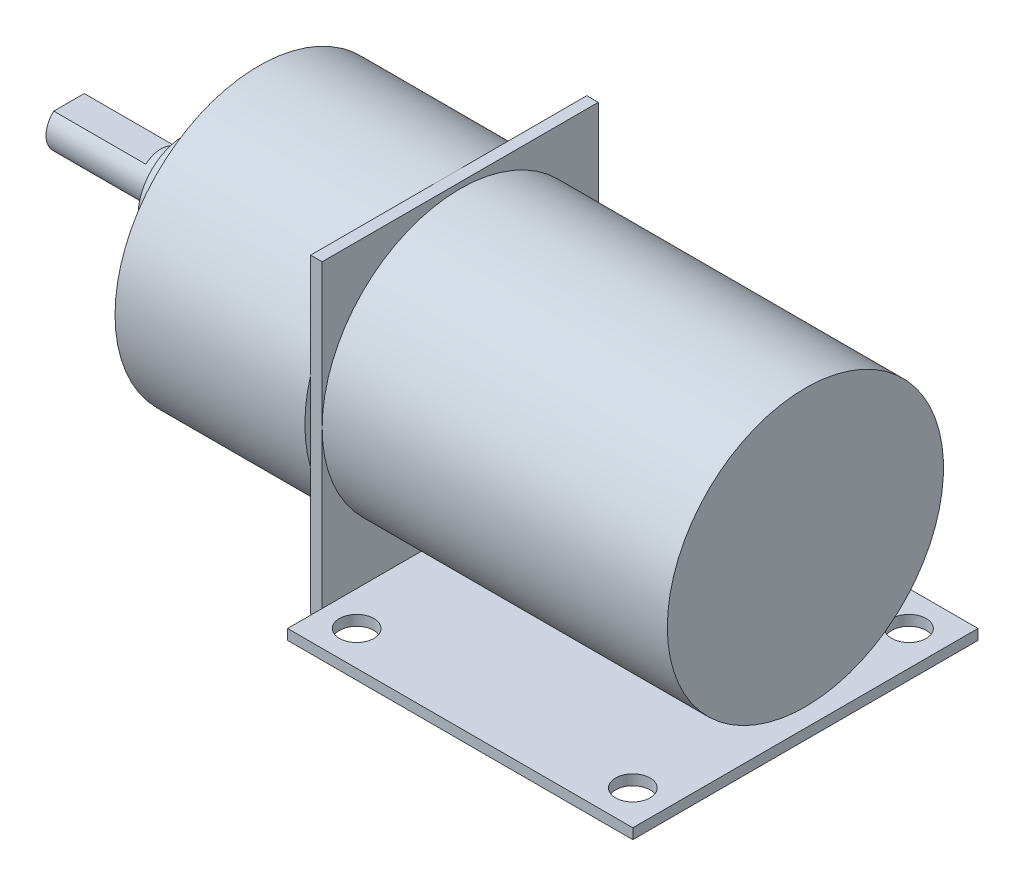
ISO-10303-21;
HEADER;
FILE_DESCRIPTION(('STEP AP214'),'2;1');
FILE_NAME('part.step','',(''),(''),'','','');
FILE_SCHEMA(('AUTOMOTIVE_DESIGN { 1 0 10303 214 1 1 1 1 }'));
ENDSEC;
DATA;
#1=APPLICATION_CONTEXT('core data for automotive mechanical design processes');
#2=APPLICATION_PROTOCOL_DEFINITION('international standard','automotive_design',2000,#1);
#3=PRODUCT_CONTEXT('',#1,'mechanical');
#4=PRODUCT('Part','Part','',(#3));
#5=PRODUCT_RELATED_PRODUCT_CATEGORY('part','',(#4));
#6=PRODUCT_DEFINITION_FORMATION('','',#4);
#7=PRODUCT_DEFINITION_CONTEXT('part definition',#1,'design');
#8=PRODUCT_DEFINITION('design','',#6,#7);
#9=PRODUCT_DEFINITION_SHAPE('','',#8);
#10=(LENGTH_UNIT() NAMED_UNIT(*) SI_UNIT(.MILLI.,.METRE.));
#11=(NAMED_UNIT(*) PLANE_ANGLE_UNIT() SI_UNIT($,.RADIAN.));
#12=(NAMED_UNIT(*) SI_UNIT($,.STERADIAN.) SOLID_ANGLE_UNIT());
#13=UNCERTAINTY_MEASURE_WITH_UNIT(LENGTH_MEASURE(1.E-05),#10,'distance_accuracy_value','');
#14=(GEOMETRIC_REPRESENTATION_CONTEXT(3) GLOBAL_UNCERTAINTY_ASSIGNED_CONTEXT((#13)) GLOBAL_UNIT_ASSIGNED_CONTEXT((#10,
#11,#12)) REPRESENTATION_CONTEXT('',''));
#15=CARTESIAN_POINT('',(0.,0.,0.));
#16=DIRECTION('',(0.,0.,1.));
#17=DIRECTION('',(1.,0.,0.));
#18=AXIS2_PLACEMENT_3D('',#15,#16,#17);
#19=CARTESIAN_POINT('',(-16.,27.,12.));
#20=DIRECTION('',(1.,0.,0.));
#21=DIRECTION('',(0.,0.,-1.));
#22=AXIS2_PLACEMENT_3D('',#19,#20,#21);
#23=PLANE('',#22);
#24=CARTESIAN_POINT('',(-16.,14.5,0.));
#25=DIRECTION('',(-1.,0.,0.));
#26=DIRECTION('',(0.,0.,1.));
#27=AXIS2_PLACEMENT_3D('',#24,#25,#26);
#28=CIRCLE('',#27,12.5);
#29=CARTESIAN_POINT('',(-16.,18.,12.));
#30=VERTEX_POINT('',#29);
#31=CARTESIAN_POINT('',(-16.,27.,0.));
#32=VERTEX_POINT('',#31);
#33=EDGE_CURVE('E172',#30,#32,#28,.T.);
#34=ORIENTED_EDGE('',*,*,#33,.F.);
#35=DIRECTION('',(0.,-1.,0.));
#36=VECTOR('',#35,1.);
#37=CARTESIAN_POINT('',(-16.,27.,12.));
#38=LINE('',#37,#36);
#39=CARTESIAN_POINT('',(-16.,27.,12.));
#40=VERTEX_POINT('',#39);
#41=EDGE_CURVE('E206',#40,#30,#38,.T.);
#42=ORIENTED_EDGE('',*,*,#41,.F.);
#43=DIRECTION('',(0.,0.,1.));
#44=VECTOR('',#43,1.);
#45=CARTESIAN_POINT('',(-16.,27.,12.));
#46=LINE('',#45,#44);
#47=EDGE_CURVE('E189',#32,#40,#46,.T.);
#48=ORIENTED_EDGE('',*,*,#47,.F.);
#49=EDGE_LOOP('',(#34,#42,#48));
#50=FACE_BOUND('',#49,.T.);
#51=ADVANCED_FACE('F33',(#50),#23,.F.);
#52=CARTESIAN_POINT('',(-16.,18.,-12.));
#53=VERTEX_POINT('',#52);
#54=EDGE_CURVE('E167',#32,#53,#28,.T.);
#55=ORIENTED_EDGE('',*,*,#54,.F.);
#56=CARTESIAN_POINT('',(-16.,27.,-12.));
#57=VERTEX_POINT('',#56);
#58=EDGE_CURVE('E190',#57,#32,#46,.T.);
#59=ORIENTED_EDGE('',*,*,#58,.F.);
#60=DIRECTION('',(0.,-1.,0.));
#61=VECTOR('',#60,1.);
#62=CARTESIAN_POINT('',(-16.,27.,-12.));
#63=LINE('',#62,#61);
#64=EDGE_CURVE('E211',#57,#53,#63,.T.);
#65=ORIENTED_EDGE('',*,*,#64,.T.);
#66=EDGE_LOOP('',(#55,#59,#65));
#67=FACE_BOUND('',#66,.T.);
#68=ADVANCED_FACE('F338',(#67),#23,.F.);
#69=CARTESIAN_POINT('',(-15.,27.,12.));
#70=DIRECTION('',(-1.,0.,0.));
#71=DIRECTION('',(0.,0.,1.));
#72=AXIS2_PLACEMENT_3D('',#69,#70,#71);
#73=PLANE('',#72);
#74=CARTESIAN_POINT('',(-15.,14.5,0.));
#75=DIRECTION('',(1.,0.,0.));
#76=DIRECTION('',(0.,0.,-1.));
#77=AXIS2_PLACEMENT_3D('',#74,#75,#76);
#78=CIRCLE('',#77,12.);
#79=CARTESIAN_POINT('',(-15.,14.5,12.));
#80=VERTEX_POINT('',#79);
#81=CARTESIAN_POINT('',(-15.,14.5,-12.));
#82=VERTEX_POINT('',#81);
#83=EDGE_CURVE('E171',#80,#82,#78,.T.);
#84=ORIENTED_EDGE('',*,*,#83,.F.);
#85=DIRECTION('',(0.,-1.,0.));
#86=VECTOR('',#85,1.);
#87=CARTESIAN_POINT('',(-15.,27.,12.));
#88=LINE('',#87,#86);
#89=CARTESIAN_POINT('',(-15.,0.900000000000001,12.));
#90=VERTEX_POINT('',#89);
#91=EDGE_CURVE('E195',#80,#90,#88,.T.);
#92=ORIENTED_EDGE('',*,*,#91,.T.);
#93=DIRECTION('',(0.,0.,1.));
#94=VECTOR('',#93,1.);
#95=CARTESIAN_POINT('',(-15.,0.9,15.));
#96=LINE('',#95,#94);
#97=CARTESIAN_POINT('',(-15.,0.900000000000001,-12.));
#98=VERTEX_POINT('',#97);
#99=EDGE_CURVE('E249',#98,#90,#96,.T.);
#100=ORIENTED_EDGE('',*,*,#99,.F.);
#101=DIRECTION('',(0.,-1.,0.));
#102=VECTOR('',#101,1.);
#103=CARTESIAN_POINT('',(-15.,27.,-12.));
#104=LINE('',#103,#102);
#105=EDGE_CURVE('E214',#82,#98,#104,.T.);
#106=ORIENTED_EDGE('',*,*,#105,.F.);
#107=EDGE_LOOP('',(#84,#92,#100,#106));
#108=FACE_BOUND('',#107,.T.);
#109=ADVANCED_FACE('F289',(#108),#73,.F.);
#110=CARTESIAN_POINT('',(-15.,0.9,15.));
#111=DIRECTION('',(1.,0.,0.));
#112=DIRECTION('',(0.,0.,-1.));
#113=AXIS2_PLACEMENT_3D('',#110,#111,#112);
#114=PLANE('',#113);
#115=CARTESIAN_POINT('',(-15.,0.,-12.));
#116=VERTEX_POINT('',#115);
#117=EDGE_CURVE('E220',#98,#116,#104,.T.);
#118=ORIENTED_EDGE('',*,*,#117,.F.);
#119=CARTESIAN_POINT('',(-15.,0.9,-15.));
#120=VERTEX_POINT('',#119);
#121=EDGE_CURVE('E245',#120,#98,#96,.T.);
#122=ORIENTED_EDGE('',*,*,#121,.F.);
#123=DIRECTION('',(0.,-1.,0.));
#124=VECTOR('',#123,1.);
#125=CARTESIAN_POINT('',(-15.,0.9,-15.));
#126=LINE('',#125,#124);
#127=CARTESIAN_POINT('',(-15.,0.,-15.));
#128=VERTEX_POINT('',#127);
#129=EDGE_CURVE('E256',#120,#128,#126,.T.);
#130=ORIENTED_EDGE('',*,*,#129,.T.);
#131=DIRECTION('',(0.,0.,1.));
#132=VECTOR('',#131,1.);
#133=CARTESIAN_POINT('',(-15.,0.,15.));
#134=LINE('',#133,#132);
#135=EDGE_CURVE('E257',#128,#116,#134,.T.);
#136=ORIENTED_EDGE('',*,*,#135,.T.);
#137=EDGE_LOOP('',(#118,#122,#130,#136));
#138=FACE_BOUND('',#137,.T.);
#139=ADVANCED_FACE('F305',(#138),#114,.F.);
#140=CARTESIAN_POINT('',(0.,0.9,0.));
#141=DIRECTION('',(0.,1.,0.));
#142=DIRECTION('',(0.,0.,1.));
#143=AXIS2_PLACEMENT_3D('',#140,#141,#142);
#144=PLANE('',#143);
#145=CARTESIAN_POINT('',(12.,0.9,12.));
#146=DIRECTION('',(0.,1.,0.));
#147=DIRECTION('',(0.,0.,1.));
#148=AXIS2_PLACEMENT_3D('',#145,#146,#147);
#149=CIRCLE('',#148,1.5);
#150=CARTESIAN_POINT('',(12.,0.9,13.5));
#151=VERTEX_POINT('',#150);
#152=EDGE_CURVE('E227',#151,#151,#149,.T.);
#153=ORIENTED_EDGE('',*,*,#152,.F.);
#154=EDGE_LOOP('',(#153));
#155=FACE_BOUND('',#154,.T.);
#156=CARTESIAN_POINT('',(-12.,0.9,-12.));
#157=DIRECTION('',(0.,1.,0.));
#158=DIRECTION('',(0.,0.,1.));
#159=AXIS2_PLACEMENT_3D('',#156,#157,#158);
#160=CIRCLE('',#159,1.5);
#161=CARTESIAN_POINT('',(-12.,0.9,-10.5));
#162=VERTEX_POINT('',#161);
#163=EDGE_CURVE('E239',#162,#162,#160,.T.);
#164=ORIENTED_EDGE('',*,*,#163,.F.);
#165=EDGE_LOOP('',(#164));
#166=FACE_BOUND('',#165,.T.);
#167=ORIENTED_EDGE('',*,*,#121,.T.);
#168=ORIENTED_EDGE('',*,*,#99,.T.);
#169=CARTESIAN_POINT('',(-15.,0.9,15.));
#170=VERTEX_POINT('',#169);
#171=EDGE_CURVE('E250',#90,#170,#96,.T.);
#172=ORIENTED_EDGE('',*,*,#171,.T.);
#173=DIRECTION('',(1.,0.,0.));
#174=VECTOR('',#173,1.);
#175=CARTESIAN_POINT('',(15.,0.9,15.));
#176=LINE('',#175,#174);
#177=CARTESIAN_POINT('',(15.,0.9,15.));
#178=VERTEX_POINT('',#177);
#179=EDGE_CURVE('E248',#170,#178,#176,.T.);
#180=ORIENTED_EDGE('',*,*,#179,.T.);
#181=DIRECTION('',(0.,0.,-1.));
#182=VECTOR('',#181,1.);
#183=CARTESIAN_POINT('',(15.,0.9,15.));
#184=LINE('',#183,#182);
#185=CARTESIAN_POINT('',(15.,0.9,-15.));
#186=VERTEX_POINT('',#185);
#187=EDGE_CURVE('E252',#178,#186,#184,.T.);
#188=ORIENTED_EDGE('',*,*,#187,.T.);
#189=DIRECTION('',(-1.,0.,0.));
#190=VECTOR('',#189,1.);
#191=CARTESIAN_POINT('',(15.,0.9,-15.));
#192=LINE('',#191,#190);
#193=EDGE_CURVE('E254',#186,#120,#192,.T.);
#194=ORIENTED_EDGE('',*,*,#193,.T.);
#195=EDGE_LOOP('',(#167,#168,#172,#180,#188,#194));
#196=FACE_BOUND('',#195,.T.);
#197=CARTESIAN_POINT('',(12.,0.9,-12.));
#198=DIRECTION('',(0.,1.,0.));
#199=DIRECTION('',(0.,0.,1.));
#200=AXIS2_PLACEMENT_3D('',#197,#198,#199);
#201=CIRCLE('',#200,1.5);
#202=CARTESIAN_POINT('',(12.,0.9,-10.5));
#203=VERTEX_POINT('',#202);
#204=EDGE_CURVE('E233',#203,#203,#201,.T.);
#205=ORIENTED_EDGE('',*,*,#204,.F.);
#206=EDGE_LOOP('',(#205));
#207=FACE_BOUND('',#206,.T.);
#208=CARTESIAN_POINT('',(-12.,0.9,12.));
#209=DIRECTION('',(0.,1.,0.));
#210=DIRECTION('',(0.,0.,1.));
#211=AXIS2_PLACEMENT_3D('',#208,#209,#210);
#212=CIRCLE('',#211,1.5);
#213=CARTESIAN_POINT('',(-12.,0.9,13.5));
#214=VERTEX_POINT('',#213);
#215=EDGE_CURVE('E221',#214,#214,#212,.T.);
#216=ORIENTED_EDGE('',*,*,#215,.F.);
#217=EDGE_LOOP('',(#216));
#218=FACE_BOUND('',#217,.T.);
#219=ADVANCED_FACE('F299',(#155,#166,#196,#207,#218),#144,.T.);
#220=CARTESIAN_POINT('',(0.,0.,0.));
#221=DIRECTION('',(0.,1.,0.));
#222=DIRECTION('',(0.,0.,1.));
#223=AXIS2_PLACEMENT_3D('',#220,#221,#222);
#224=PLANE('',#223);
#225=ORIENTED_EDGE('',*,*,#135,.F.);
#226=DIRECTION('',(-1.,0.,0.));
#227=VECTOR('',#226,1.);
#228=CARTESIAN_POINT('',(15.,0.,-15.));
#229=LINE('',#228,#227);
#230=CARTESIAN_POINT('',(15.,0.,-15.));
#231=VERTEX_POINT('',#230);
#232=EDGE_CURVE('E264',#231,#128,#229,.T.);
#233=ORIENTED_EDGE('',*,*,#232,.F.);
#234=DIRECTION('',(0.,0.,-1.));
#235=VECTOR('',#234,1.);
#236=CARTESIAN_POINT('',(15.,0.,15.));
#237=LINE('',#236,#235);
#238=CARTESIAN_POINT('',(15.,0.,15.));
#239=VERTEX_POINT('',#238);
#240=EDGE_CURVE('E262',#239,#231,#237,.T.);
#241=ORIENTED_EDGE('',*,*,#240,.F.);
#242=DIRECTION('',(1.,0.,0.));
#243=VECTOR('',#242,1.);
#244=CARTESIAN_POINT('',(15.,0.,15.));
#245=LINE('',#244,#243);
#246=CARTESIAN_POINT('',(-15.,0.,15.));
#247=VERTEX_POINT('',#246);
#248=EDGE_CURVE('E260',#247,#239,#245,.T.);
#249=ORIENTED_EDGE('',*,*,#248,.F.);
#250=CARTESIAN_POINT('',(-15.,0.,12.));
#251=VERTEX_POINT('',#250);
#252=EDGE_CURVE('E242',#251,#247,#134,.T.);
#253=ORIENTED_EDGE('',*,*,#252,.F.);
#254=DIRECTION('',(1.,0.,0.));
#255=VECTOR('',#254,1.);
#256=CARTESIAN_POINT('',(-15.,0.,12.));
#257=LINE('',#256,#255);
#258=CARTESIAN_POINT('',(-16.,0.,12.));
#259=VERTEX_POINT('',#258);
#260=EDGE_CURVE('E187',#259,#251,#257,.T.);
#261=ORIENTED_EDGE('',*,*,#260,.F.);
#262=DIRECTION('',(0.,0.,1.));
#263=VECTOR('',#262,1.);
#264=CARTESIAN_POINT('',(-16.,0.,12.));
#265=LINE('',#264,#263);
#266=CARTESIAN_POINT('',(-16.,0.,-12.));
#267=VERTEX_POINT('',#266);
#268=EDGE_CURVE('E198',#267,#259,#265,.T.);
#269=ORIENTED_EDGE('',*,*,#268,.F.);
#270=DIRECTION('',(-1.,0.,0.));
#271=VECTOR('',#270,1.);
#272=CARTESIAN_POINT('',(-15.,0.,-12.));
#273=LINE('',#272,#271);
#274=EDGE_CURVE('E182',#116,#267,#273,.T.);
#275=ORIENTED_EDGE('',*,*,#274,.F.);
#276=EDGE_LOOP('',(#225,#233,#241,#249,#253,#261,#269,#275));
#277=FACE_BOUND('',#276,.T.);
#278=CARTESIAN_POINT('',(-12.,0.,-12.));
#279=DIRECTION('',(0.,1.,0.));
#280=DIRECTION('',(0.,0.,1.));
#281=AXIS2_PLACEMENT_3D('',#278,#279,#280);
#282=CIRCLE('',#281,1.5);
#283=CARTESIAN_POINT('',(-12.,0.,-10.5));
#284=VERTEX_POINT('',#283);
#285=EDGE_CURVE('E236',#284,#284,#282,.T.);
#286=ORIENTED_EDGE('',*,*,#285,.T.);
#287=EDGE_LOOP('',(#286));
#288=FACE_BOUND('',#287,.T.);
#289=CARTESIAN_POINT('',(12.,0.,-12.));
#290=DIRECTION('',(0.,1.,0.));
#291=DIRECTION('',(0.,0.,1.));
#292=AXIS2_PLACEMENT_3D('',#289,#290,#291);
#293=CIRCLE('',#292,1.5);
#294=CARTESIAN_POINT('',(12.,0.,-10.5));
#295=VERTEX_POINT('',#294);
#296=EDGE_CURVE('E230',#295,#295,#293,.T.);
#297=ORIENTED_EDGE('',*,*,#296,.T.);
#298=EDGE_LOOP('',(#297));
#299=FACE_BOUND('',#298,.T.);
#300=CARTESIAN_POINT('',(12.,0.,12.));
#301=DIRECTION('',(0.,1.,0.));
#302=DIRECTION('',(0.,0.,1.));
#303=AXIS2_PLACEMENT_3D('',#300,#301,#302);
#304=CIRCLE('',#303,1.5);
#305=CARTESIAN_POINT('',(12.,0.,13.5));
#306=VERTEX_POINT('',#305);
#307=EDGE_CURVE('E224',#306,#306,#304,.T.);
#308=ORIENTED_EDGE('',*,*,#307,.T.);
#309=EDGE_LOOP('',(#308));
#310=FACE_BOUND('',#309,.T.);
#311=CARTESIAN_POINT('',(-12.,0.,12.));
#312=DIRECTION('',(0.,1.,0.));
#313=DIRECTION('',(0.,0.,1.));
#314=AXIS2_PLACEMENT_3D('',#311,#312,#313);
#315=CIRCLE('',#314,1.5);
#316=CARTESIAN_POINT('',(-12.,0.,13.5));
#317=VERTEX_POINT('',#316);
#318=EDGE_CURVE('E219',#317,#317,#315,.T.);
#319=ORIENTED_EDGE('',*,*,#318,.T.);
#320=EDGE_LOOP('',(#319));
#321=FACE_BOUND('',#320,.T.);
#322=ADVANCED_FACE('F312',(#277,#288,#299,#310,#321),#224,.F.);
#323=ORIENTED_EDGE('',*,*,#171,.F.);
#324=EDGE_CURVE('E205',#90,#251,#88,.T.);
#325=ORIENTED_EDGE('',*,*,#324,.T.);
#326=ORIENTED_EDGE('',*,*,#252,.T.);
#327=DIRECTION('',(0.,-1.,0.));
#328=VECTOR('',#327,1.);
#329=CARTESIAN_POINT('',(-15.,0.9,15.));
#330=LINE('',#329,#328);
#331=EDGE_CURVE('E37',#170,#247,#330,.T.);
#332=ORIENTED_EDGE('',*,*,#331,.F.);
#333=EDGE_LOOP('',(#323,#325,#326,#332));
#334=FACE_BOUND('',#333,.T.);
#335=ADVANCED_FACE('F35',(#334),#114,.F.);
#336=CARTESIAN_POINT('',(15.,0.9,15.));
#337=DIRECTION('',(0.,0.,-1.));
#338=DIRECTION('',(-1.,0.,0.));
#339=AXIS2_PLACEMENT_3D('',#336,#337,#338);
#340=PLANE('',#339);
#341=ORIENTED_EDGE('',*,*,#248,.T.);
#342=DIRECTION('',(0.,-1.,0.));
#343=VECTOR('',#342,1.);
#344=CARTESIAN_POINT('',(15.,0.9,15.));
#345=LINE('',#344,#343);
#346=EDGE_CURVE('E270',#178,#239,#345,.T.);
#347=ORIENTED_EDGE('',*,*,#346,.F.);
#348=ORIENTED_EDGE('',*,*,#179,.F.);
#349=ORIENTED_EDGE('',*,*,#331,.T.);
#350=EDGE_LOOP('',(#341,#347,#348,#349));
#351=FACE_BOUND('',#350,.T.);
#352=ADVANCED_FACE('F400',(#351),#340,.F.);
#353=CARTESIAN_POINT('',(15.,0.9,15.));
#354=DIRECTION('',(-1.,0.,0.));
#355=DIRECTION('',(0.,0.,1.));
#356=AXIS2_PLACEMENT_3D('',#353,#354,#355);
#357=PLANE('',#356);
#358=ORIENTED_EDGE('',*,*,#240,.T.);
#359=DIRECTION('',(0.,-1.,0.));
#360=VECTOR('',#359,1.);
#361=CARTESIAN_POINT('',(15.,0.9,-15.));
#362=LINE('',#361,#360);
#363=EDGE_CURVE('E268',#186,#231,#362,.T.);
#364=ORIENTED_EDGE('',*,*,#363,.F.);
#365=ORIENTED_EDGE('',*,*,#187,.F.);
#366=ORIENTED_EDGE('',*,*,#346,.T.);
#367=EDGE_LOOP('',(#358,#364,#365,#366));
#368=FACE_BOUND('',#367,.T.);
#369=ADVANCED_FACE('F397',(#368),#357,.F.);
#370=CARTESIAN_POINT('',(15.,0.9,-15.));
#371=DIRECTION('',(0.,0.,1.));
#372=DIRECTION('',(1.,0.,0.));
#373=AXIS2_PLACEMENT_3D('',#370,#371,#372);
#374=PLANE('',#373);
#375=ORIENTED_EDGE('',*,*,#232,.T.);
#376=ORIENTED_EDGE('',*,*,#129,.F.);
#377=ORIENTED_EDGE('',*,*,#193,.F.);
#378=ORIENTED_EDGE('',*,*,#363,.T.);
#379=EDGE_LOOP('',(#375,#376,#377,#378));
#380=FACE_BOUND('',#379,.T.);
#381=ADVANCED_FACE('F388',(#380),#374,.F.);
#382=CARTESIAN_POINT('',(-12.,0.9,-12.));
#383=DIRECTION('',(0.,-1.,0.));
#384=DIRECTION('',(0.,0.,-1.));
#385=AXIS2_PLACEMENT_3D('',#382,#383,#384);
#386=CYLINDRICAL_SURFACE('',#385,1.5);
#387=ORIENTED_EDGE('',*,*,#163,.T.);
#388=EDGE_LOOP('',(#387));
#389=FACE_BOUND('',#388,.T.);
#390=ORIENTED_EDGE('',*,*,#285,.F.);
#391=EDGE_LOOP('',(#390));
#392=FACE_BOUND('',#391,.T.);
#393=ADVANCED_FACE('F384',(#389,#392),#386,.F.);
#394=CARTESIAN_POINT('',(12.,0.9,-12.));
#395=DIRECTION('',(0.,-1.,0.));
#396=DIRECTION('',(0.,0.,-1.));
#397=AXIS2_PLACEMENT_3D('',#394,#395,#396);
#398=CYLINDRICAL_SURFACE('',#397,1.5);
#399=ORIENTED_EDGE('',*,*,#204,.T.);
#400=EDGE_LOOP('',(#399));
#401=FACE_BOUND('',#400,.T.);
#402=ORIENTED_EDGE('',*,*,#296,.F.);
#403=EDGE_LOOP('',(#402));
#404=FACE_BOUND('',#403,.T.);
#405=ADVANCED_FACE('F380',(#401,#404),#398,.F.);
#406=CARTESIAN_POINT('',(12.,0.9,12.));
#407=DIRECTION('',(0.,-1.,0.));
#408=DIRECTION('',(0.,0.,-1.));
#409=AXIS2_PLACEMENT_3D('',#406,#407,#408);
#410=CYLINDRICAL_SURFACE('',#409,1.5);
#411=ORIENTED_EDGE('',*,*,#152,.T.);
#412=EDGE_LOOP('',(#411));
#413=FACE_BOUND('',#412,.T.);
#414=ORIENTED_EDGE('',*,*,#307,.F.);
#415=EDGE_LOOP('',(#414));
#416=FACE_BOUND('',#415,.T.);
#417=ADVANCED_FACE('F376',(#413,#416),#410,.F.);
#418=CARTESIAN_POINT('',(-12.,0.9,12.));
#419=DIRECTION('',(0.,-1.,0.));
#420=DIRECTION('',(0.,0.,-1.));
#421=AXIS2_PLACEMENT_3D('',#418,#419,#420);
#422=CYLINDRICAL_SURFACE('',#421,1.5);
#423=ORIENTED_EDGE('',*,*,#215,.T.);
#424=EDGE_LOOP('',(#423));
#425=FACE_BOUND('',#424,.T.);
#426=ORIENTED_EDGE('',*,*,#318,.F.);
#427=EDGE_LOOP('',(#426));
#428=FACE_BOUND('',#427,.T.);
#429=ADVANCED_FACE('F371',(#425,#428),#422,.F.);
#430=EDGE_CURVE('E176',#82,#80,#78,.T.);
#431=ORIENTED_EDGE('',*,*,#430,.F.);
#432=CARTESIAN_POINT('',(-15.,27.,-12.));
#433=VERTEX_POINT('',#432);
#434=EDGE_CURVE('E216',#433,#82,#104,.T.);
#435=ORIENTED_EDGE('',*,*,#434,.F.);
#436=DIRECTION('',(0.,0.,-1.));
#437=VECTOR('',#436,1.);
#438=CARTESIAN_POINT('',(-15.,27.,12.));
#439=LINE('',#438,#437);
#440=CARTESIAN_POINT('',(-15.,27.,12.));
#441=VERTEX_POINT('',#440);
#442=EDGE_CURVE('E183',#441,#433,#439,.T.);
#443=ORIENTED_EDGE('',*,*,#442,.F.);
#444=EDGE_CURVE('E202',#441,#80,#88,.T.);
#445=ORIENTED_EDGE('',*,*,#444,.T.);
#446=EDGE_LOOP('',(#431,#435,#443,#445));
#447=FACE_BOUND('',#446,.T.);
#448=ADVANCED_FACE('F342',(#447),#73,.F.);
#449=CARTESIAN_POINT('',(-15.,27.,-12.));
#450=DIRECTION('',(0.,0.,1.));
#451=DIRECTION('',(1.,0.,0.));
#452=AXIS2_PLACEMENT_3D('',#449,#450,#451);
#453=PLANE('',#452);
#454=ORIENTED_EDGE('',*,*,#274,.T.);
#455=CARTESIAN_POINT('',(-16.,11.,-12.));
#456=VERTEX_POINT('',#455);
#457=EDGE_CURVE('E209',#456,#267,#63,.T.);
#458=ORIENTED_EDGE('',*,*,#457,.F.);
#459=EDGE_CURVE('E215',#53,#456,#63,.T.);
#460=ORIENTED_EDGE('',*,*,#459,.F.);
#461=ORIENTED_EDGE('',*,*,#64,.F.);
#462=DIRECTION('',(-1.,0.,0.));
#463=VECTOR('',#462,1.);
#464=CARTESIAN_POINT('',(-15.,27.,-12.));
#465=LINE('',#464,#463);
#466=EDGE_CURVE('E186',#433,#57,#465,.T.);
#467=ORIENTED_EDGE('',*,*,#466,.F.);
#468=ORIENTED_EDGE('',*,*,#434,.T.);
#469=ORIENTED_EDGE('',*,*,#105,.T.);
#470=ORIENTED_EDGE('',*,*,#117,.T.);
#471=EDGE_LOOP('',(#454,#458,#460,#461,#467,#468,#469,#470));
#472=FACE_BOUND('',#471,.T.);
#473=ADVANCED_FACE('F309',(#472),#453,.F.);
#474=CARTESIAN_POINT('',(-16.,11.,12.));
#475=VERTEX_POINT('',#474);
#476=EDGE_CURVE('E58',#456,#475,#28,.T.);
#477=ORIENTED_EDGE('',*,*,#476,.F.);
#478=ORIENTED_EDGE('',*,*,#457,.T.);
#479=ORIENTED_EDGE('',*,*,#268,.T.);
#480=EDGE_CURVE('E204',#475,#259,#38,.T.);
#481=ORIENTED_EDGE('',*,*,#480,.F.);
#482=EDGE_LOOP('',(#477,#478,#479,#481));
#483=FACE_BOUND('',#482,.T.);
#484=ADVANCED_FACE('F315',(#483),#23,.F.);
#485=CARTESIAN_POINT('',(-15.,27.,12.));
#486=DIRECTION('',(0.,0.,-1.));
#487=DIRECTION('',(-1.,0.,0.));
#488=AXIS2_PLACEMENT_3D('',#485,#486,#487);
#489=PLANE('',#488);
#490=ORIENTED_EDGE('',*,*,#260,.T.);
#491=ORIENTED_EDGE('',*,*,#324,.F.);
#492=ORIENTED_EDGE('',*,*,#91,.F.);
#493=ORIENTED_EDGE('',*,*,#444,.F.);
#494=DIRECTION('',(1.,0.,0.));
#495=VECTOR('',#494,1.);
#496=CARTESIAN_POINT('',(-15.,27.,12.));
#497=LINE('',#496,#495);
#498=EDGE_CURVE('E193',#40,#441,#497,.T.);
#499=ORIENTED_EDGE('',*,*,#498,.F.);
#500=ORIENTED_EDGE('',*,*,#41,.T.);
#501=EDGE_CURVE('E210',#30,#475,#38,.T.);
#502=ORIENTED_EDGE('',*,*,#501,.T.);
#503=ORIENTED_EDGE('',*,*,#480,.T.);
#504=EDGE_LOOP('',(#490,#491,#492,#493,#499,#500,#502,#503));
#505=FACE_BOUND('',#504,.T.);
#506=ADVANCED_FACE('F296',(#505),#489,.F.);
#507=CARTESIAN_POINT('',(0.,27.,0.));
#508=DIRECTION('',(0.,1.,0.));
#509=DIRECTION('',(0.,0.,1.));
#510=AXIS2_PLACEMENT_3D('',#507,#508,#509);
#511=PLANE('',#510);
#512=ORIENTED_EDGE('',*,*,#442,.T.);
#513=ORIENTED_EDGE('',*,*,#466,.T.);
#514=ORIENTED_EDGE('',*,*,#58,.T.);
#515=ORIENTED_EDGE('',*,*,#47,.T.);
#516=ORIENTED_EDGE('',*,*,#498,.T.);
#517=EDGE_LOOP('',(#512,#513,#514,#515,#516));
#518=FACE_BOUND('',#517,.T.);
#519=ADVANCED_FACE('F336',(#518),#511,.T.);
#520=CARTESIAN_POINT('',(48.9411254969543,14.5,0.));
#521=DIRECTION('',(-1.,0.,0.));
#522=DIRECTION('',(0.,0.,1.));
#523=AXIS2_PLACEMENT_3D('',#520,#521,#522);
#524=CYLINDRICAL_SURFACE('',#523,12.);
#525=CARTESIAN_POINT('',(15.,14.5,0.));
#526=DIRECTION('',(-1.,0.,0.));
#527=DIRECTION('',(0.,0.,1.));
#528=AXIS2_PLACEMENT_3D('',#525,#526,#527);
#529=CIRCLE('',#528,12.);
#530=CARTESIAN_POINT('',(15.,14.5,12.));
#531=VERTEX_POINT('',#530);
#532=EDGE_CURVE('E179',#531,#531,#529,.T.);
#533=ORIENTED_EDGE('',*,*,#532,.T.);
#534=EDGE_LOOP('',(#533));
#535=FACE_BOUND('',#534,.T.);
#536=ORIENTED_EDGE('',*,*,#430,.T.);
#537=ORIENTED_EDGE('',*,*,#83,.T.);
#538=EDGE_LOOP('',(#536,#537));
#539=FACE_BOUND('',#538,.T.);
#540=ADVANCED_FACE('F344',(#535,#539),#524,.T.);
#541=CARTESIAN_POINT('',(15.,0.9,15.));
#542=DIRECTION('',(-1.,0.,0.));
#543=DIRECTION('',(0.,0.,1.));
#544=AXIS2_PLACEMENT_3D('',#541,#542,#543);
#545=PLANE('',#544);
#546=ORIENTED_EDGE('',*,*,#532,.F.);
#547=EDGE_LOOP('',(#546));
#548=FACE_BOUND('',#547,.T.);
#549=ADVANCED_FACE('F346',(#548),#545,.F.);
#550=CARTESIAN_POINT('',(-16.,14.5,0.));
#551=DIRECTION('',(-1.,0.,0.));
#552=DIRECTION('',(0.,0.,1.));
#553=AXIS2_PLACEMENT_3D('',#550,#551,#552);
#554=PLANE('',#553);
#555=EDGE_CURVE('E175',#53,#456,#28,.T.);
#556=ORIENTED_EDGE('',*,*,#555,.F.);
#557=ORIENTED_EDGE('',*,*,#459,.T.);
#558=EDGE_LOOP('',(#556,#557));
#559=FACE_BOUND('',#558,.T.);
#560=ADVANCED_FACE('F321',(#559),#554,.F.);
#561=CARTESIAN_POINT('',(-32.5,14.5,0.));
#562=DIRECTION('',(1.,0.,0.));
#563=DIRECTION('',(0.,0.,-1.));
#564=AXIS2_PLACEMENT_3D('',#561,#562,#563);
#565=CYLINDRICAL_SURFACE('',#564,12.5);
#566=CARTESIAN_POINT('',(-32.5,14.5,0.));
#567=DIRECTION('',(-1.,0.,0.));
#568=DIRECTION('',(0.,0.,1.));
#569=AXIS2_PLACEMENT_3D('',#566,#567,#568);
#570=CIRCLE('',#569,12.5);
#571=CARTESIAN_POINT('',(-32.5,14.5,12.5));
#572=VERTEX_POINT('',#571);
#573=EDGE_CURVE('E168',#572,#572,#570,.T.);
#574=ORIENTED_EDGE('',*,*,#573,.F.);
#575=EDGE_LOOP('',(#574));
#576=FACE_BOUND('',#575,.T.);
#577=ORIENTED_EDGE('',*,*,#33,.T.);
#578=ORIENTED_EDGE('',*,*,#54,.T.);
#579=ORIENTED_EDGE('',*,*,#555,.T.);
#580=ORIENTED_EDGE('',*,*,#476,.T.);
#581=EDGE_CURVE('E164',#475,#30,#28,.T.);
#582=ORIENTED_EDGE('',*,*,#581,.T.);
#583=EDGE_LOOP('',(#577,#578,#579,#580,#582));
#584=FACE_BOUND('',#583,.T.);
#585=ADVANCED_FACE('F325',(#576,#584),#565,.T.);
#586=CARTESIAN_POINT('',(-32.5,14.5,0.));
#587=DIRECTION('',(-1.,0.,0.));
#588=DIRECTION('',(0.,0.,1.));
#589=AXIS2_PLACEMENT_3D('',#586,#587,#588);
#590=PLANE('',#589);
#591=CARTESIAN_POINT('',(-32.5,14.5,0.));
#592=DIRECTION('',(-1.,0.,0.));
#593=DIRECTION('',(0.,0.,1.));
#594=AXIS2_PLACEMENT_3D('',#591,#592,#593);
#595=CIRCLE('',#594,4.);
#596=CARTESIAN_POINT('',(-32.5,14.5,-4.));
#597=VERTEX_POINT('',#596);
#598=EDGE_CURVE('E42',#597,#597,#595,.T.);
#599=ORIENTED_EDGE('',*,*,#598,.F.);
#600=EDGE_LOOP('',(#599));
#601=FACE_BOUND('',#600,.T.);
#602=ORIENTED_EDGE('',*,*,#573,.T.);
#603=EDGE_LOOP('',(#602));
#604=FACE_BOUND('',#603,.T.);
#605=ADVANCED_FACE('F462',(#601,#604),#590,.T.);
#606=ORIENTED_EDGE('',*,*,#501,.F.);
#607=ORIENTED_EDGE('',*,*,#581,.F.);
#608=EDGE_LOOP('',(#606,#607));
#609=FACE_BOUND('',#608,.T.);
#610=ADVANCED_FACE('F329',(#609),#554,.F.);
#611=CARTESIAN_POINT('',(-39.,14.5,0.));
#612=DIRECTION('',(1.,0.,0.));
#613=DIRECTION('',(0.,0.,-1.));
#614=AXIS2_PLACEMENT_3D('',#611,#612,#613);
#615=CYLINDRICAL_SURFACE('',#614,4.);
#616=CARTESIAN_POINT('',(-39.,14.5,0.));
#617=DIRECTION('',(-1.,0.,0.));
#618=DIRECTION('',(0.,0.,1.));
#619=AXIS2_PLACEMENT_3D('',#616,#617,#618);
#620=CIRCLE('',#619,4.);
#621=CARTESIAN_POINT('',(-39.,14.5,-3.99999999999999));
#622=VERTEX_POINT('',#621);
#623=EDGE_CURVE('E160',#622,#622,#620,.T.);
#624=CARTESIAN_POINT('',(-39.,14.5,-3.99999999999999));
#625=CARTESIAN_POINT('',(-38.9322916666667,14.5,-3.99999999999999));
#626=CARTESIAN_POINT('',(-38.8645833333333,14.5,-3.99999999999999));
#627=CARTESIAN_POINT('',(-38.7291666666667,14.5,-3.99999999999999));
#628=CARTESIAN_POINT('',(-38.6614583333333,14.5,-3.99999999999999));
#629=CARTESIAN_POINT('',(-38.5260416666667,14.5,-3.99999999999999));
#630=CARTESIAN_POINT('',(-38.4583333333333,14.5,-3.99999999999999));
#631=CARTESIAN_POINT('',(-38.3229166666667,14.5,-3.99999999999999));
#632=CARTESIAN_POINT('',(-38.2552083333333,14.5,-3.99999999999999));
#633=CARTESIAN_POINT('',(-38.1197916666667,14.5,-3.99999999999999));
#634=CARTESIAN_POINT('',(-38.0520833333333,14.5,-3.99999999999999));
#635=CARTESIAN_POINT('',(-37.9166666666667,14.5,-3.99999999999999));
#636=CARTESIAN_POINT('',(-37.8489583333333,14.5,-3.99999999999999));
#637=CARTESIAN_POINT('',(-37.7135416666667,14.5,-3.99999999999999));
#638=CARTESIAN_POINT('',(-37.6458333333333,14.5,-3.99999999999999));
#639=CARTESIAN_POINT('',(-37.5104166666667,14.5,-3.99999999999999));
#640=CARTESIAN_POINT('',(-37.4427083333333,14.5,-3.99999999999999));
#641=CARTESIAN_POINT('',(-37.3072916666667,14.5,-3.99999999999999));
#642=CARTESIAN_POINT('',(-37.2395833333333,14.5,-3.99999999999999));
#643=CARTESIAN_POINT('',(-37.1041666666667,14.5,-3.99999999999999));
#644=CARTESIAN_POINT('',(-37.0364583333333,14.5,-3.99999999999999));
#645=CARTESIAN_POINT('',(-36.9010416666667,14.5,-3.99999999999999));
#646=CARTESIAN_POINT('',(-36.8333333333333,14.5,-3.99999999999999));
#647=CARTESIAN_POINT('',(-36.6979166666667,14.5,-3.99999999999999));
#648=CARTESIAN_POINT('',(-36.6302083333333,14.5,-3.99999999999999));
#649=CARTESIAN_POINT('',(-36.4947916666667,14.5,-3.99999999999999));
#650=CARTESIAN_POINT('',(-36.4270833333333,14.5,-3.99999999999999));
#651=CARTESIAN_POINT('',(-36.2916666666667,14.5,-3.99999999999999));
#652=CARTESIAN_POINT('',(-36.2239583333333,14.5,-3.99999999999999));
#653=CARTESIAN_POINT('',(-36.0885416666667,14.5,-3.99999999999999));
#654=CARTESIAN_POINT('',(-36.0208333333333,14.5,-4.));
#655=CARTESIAN_POINT('',(-35.8854166666667,14.5,-4.));
#656=CARTESIAN_POINT('',(-35.8177083333333,14.5,-4.));
#657=CARTESIAN_POINT('',(-35.6822916666667,14.5,-4.));
#658=CARTESIAN_POINT('',(-35.6145833333333,14.5,-4.));
#659=CARTESIAN_POINT('',(-35.4791666666667,14.5,-4.));
#660=CARTESIAN_POINT('',(-35.4114583333333,14.5,-4.));
#661=CARTESIAN_POINT('',(-35.2760416666667,14.5,-4.));
#662=CARTESIAN_POINT('',(-35.2083333333333,14.5,-4.));
#663=CARTESIAN_POINT('',(-35.0729166666667,14.5,-4.));
#664=CARTESIAN_POINT('',(-35.0052083333333,14.5,-4.));
#665=CARTESIAN_POINT('',(-34.8697916666667,14.5,-4.));
#666=CARTESIAN_POINT('',(-34.8020833333333,14.5,-4.));
#667=CARTESIAN_POINT('',(-34.6666666666667,14.5,-4.));
#668=CARTESIAN_POINT('',(-34.5989583333333,14.5,-4.));
#669=CARTESIAN_POINT('',(-34.4635416666667,14.5,-4.));
#670=CARTESIAN_POINT('',(-34.3958333333333,14.5,-4.));
#671=CARTESIAN_POINT('',(-34.2604166666667,14.5,-4.));
#672=CARTESIAN_POINT('',(-34.1927083333333,14.5,-4.));
#673=CARTESIAN_POINT('',(-34.0572916666667,14.5,-4.));
#674=CARTESIAN_POINT('',(-33.9895833333333,14.5,-4.));
#675=CARTESIAN_POINT('',(-33.8541666666667,14.5,-4.));
#676=CARTESIAN_POINT('',(-33.7864583333333,14.5,-4.));
#677=CARTESIAN_POINT('',(-33.6510416666667,14.5,-4.));
#678=CARTESIAN_POINT('',(-33.5833333333333,14.5,-4.));
#679=CARTESIAN_POINT('',(-33.4479166666667,14.5,-4.));
#680=CARTESIAN_POINT('',(-33.3802083333333,14.5,-4.));
#681=CARTESIAN_POINT('',(-33.2447916666667,14.5,-4.));
#682=CARTESIAN_POINT('',(-33.1770833333333,14.5,-4.));
#683=CARTESIAN_POINT('',(-33.0416666666667,14.5,-4.));
#684=CARTESIAN_POINT('',(-32.9739583333333,14.5,-4.));
#685=CARTESIAN_POINT('',(-32.8385416666667,14.5,-4.));
#686=CARTESIAN_POINT('',(-32.7708333333333,14.5,-4.));
#687=CARTESIAN_POINT('',(-32.6354166666667,14.5,-4.));
#688=CARTESIAN_POINT('',(-32.5677083333333,14.5,-4.));
#689=CARTESIAN_POINT('',(-32.5,14.5,-4.));
#690=B_SPLINE_CURVE_WITH_KNOTS('',3,(#624,#625,#626,#627,#628,#629,#630,#631,#632,#633,#634,
#635,#636,#637,#638,#639,#640,#641,#642,#643,#644,#645,#646,#647,#648,#649,#650,#651,#652,#653,
#654,#655,#656,#657,#658,#659,#660,#661,#662,#663,#664,#665,#666,#667,#668,#669,#670,#671,#672,
#673,#674,#675,#676,#677,#678,#679,#680,#681,#682,#683,#684,#685,#686,#687,#688,#689),
.UNSPECIFIED.,.F.,.F.,(4,2,2,2,2,2,2,2,2,2,2,2,2,2,2,2,2,2,2,2,2,2,2,2,2,2,2,2,2,2,2,2,4),(0.,
0.203125000000005,0.406250000000004,0.609375000000002,0.812500000000001,1.01562500000001,
1.21875,1.421875,1.625,1.828125,2.03125000000001,2.234375,2.4375,2.640625,2.84375000000001,
3.046875,3.25,3.453125,3.65625,3.85937500000001,4.0625,4.265625,4.46875,4.671875,4.875,5.078125,
5.28125,5.484375,5.6875,5.890625,6.09375,6.296875,6.5),.UNSPECIFIED.);
#691=EDGE_CURVE('BSEAM474',#622,#597,#690,.T.);
#692=ORIENTED_EDGE('',*,*,#623,.F.);
#693=ORIENTED_EDGE('',*,*,#598,.T.);
#694=ORIENTED_EDGE('',*,*,#691,.T.);
#695=ORIENTED_EDGE('',*,*,#691,.F.);
#696=EDGE_LOOP('',(#692,#694,#693,#695));
#697=FACE_BOUND('',#696,.T.);
#698=ADVANCED_FACE('F474',(#697),#615,.T.);
#699=CARTESIAN_POINT('',(-39.,14.5,0.));
#700=DIRECTION('',(-1.,0.,0.));
#701=DIRECTION('',(0.,0.,1.));
#702=AXIS2_PLACEMENT_3D('',#699,#700,#701);
#703=PLANE('',#702);
#704=CARTESIAN_POINT('',(-39.,14.5,0.));
#705=DIRECTION('',(-1.,0.,0.));
#706=DIRECTION('',(0.,0.,1.));
#707=AXIS2_PLACEMENT_3D('',#704,#705,#706);
#708=CIRCLE('',#707,2.);
#709=CARTESIAN_POINT('',(-39.,14.5,2.00000000000001));
#710=VERTEX_POINT('',#709);
#711=EDGE_CURVE('E11',#710,#710,#708,.T.);
#712=ORIENTED_EDGE('',*,*,#711,.F.);
#713=EDGE_LOOP('',(#712));
#714=FACE_BOUND('',#713,.T.);
#715=ORIENTED_EDGE('',*,*,#623,.T.);
#716=EDGE_LOOP('',(#715));
#717=FACE_BOUND('',#716,.T.);
#718=ADVANCED_FACE('F489',(#714,#717),#703,.T.);
#719=CARTESIAN_POINT('',(-49.,14.5,0.));
#720=DIRECTION('',(1.,0.,0.));
#721=DIRECTION('',(0.,0.,-1.));
#722=AXIS2_PLACEMENT_3D('',#719,#720,#721);
#723=CYLINDRICAL_SURFACE('',#722,2.);
#724=CARTESIAN_POINT('',(-49.,14.5,0.));
#725=DIRECTION('',(-1.,0.,0.));
#726=DIRECTION('',(0.,0.,1.));
#727=AXIS2_PLACEMENT_3D('',#724,#725,#726);
#728=CIRCLE('',#727,2.);
#729=CARTESIAN_POINT('',(-49.,16.,-1.32287565553229));
#730=VERTEX_POINT('',#729);
#731=CARTESIAN_POINT('',(-49.,16.,1.3228756555323));
#732=VERTEX_POINT('',#731);
#733=EDGE_CURVE('E155',#730,#732,#728,.T.);
#734=ORIENTED_EDGE('',*,*,#733,.F.);
#735=DIRECTION('',(-1.,0.,0.));
#736=VECTOR('',#735,1.);
#737=CARTESIAN_POINT('',(-41.,16.,-1.32287565553229));
#738=LINE('',#737,#736);
#739=CARTESIAN_POINT('',(-41.,16.,-1.32287565553229));
#740=VERTEX_POINT('',#739);
#741=EDGE_CURVE('E50',#740,#730,#738,.T.);
#742=ORIENTED_EDGE('',*,*,#741,.F.);
#743=CARTESIAN_POINT('',(-41.,14.5,0.));
#744=DIRECTION('',(-1.,0.,0.));
#745=DIRECTION('',(0.,0.,1.));
#746=AXIS2_PLACEMENT_3D('',#743,#744,#745);
#747=CIRCLE('',#746,2.);
#748=CARTESIAN_POINT('',(-41.,16.,1.3228756555323));
#749=VERTEX_POINT('',#748);
#750=EDGE_CURVE('E141',#749,#740,#747,.T.);
#751=ORIENTED_EDGE('',*,*,#750,.F.);
#752=DIRECTION('',(-1.,0.,0.));
#753=VECTOR('',#752,1.);
#754=CARTESIAN_POINT('',(-41.,16.,1.3228756555323));
#755=LINE('',#754,#753);
#756=EDGE_CURVE('E149',#749,#732,#755,.T.);
#757=ORIENTED_EDGE('',*,*,#756,.T.);
#758=EDGE_LOOP('',(#734,#742,#751,#757));
#759=FACE_BOUND('',#758,.T.);
#760=ORIENTED_EDGE('',*,*,#711,.T.);
#761=EDGE_LOOP('',(#760));
#762=FACE_BOUND('',#761,.T.);
#763=ADVANCED_FACE('F152',(#759,#762),#723,.T.);
#764=CARTESIAN_POINT('',(-49.,14.5,0.));
#765=DIRECTION('',(-1.,0.,0.));
#766=DIRECTION('',(0.,0.,1.));
#767=AXIS2_PLACEMENT_3D('',#764,#765,#766);
#768=PLANE('',#767);
#769=DIRECTION('',(0.,0.,1.));
#770=VECTOR('',#769,1.);
#771=CARTESIAN_POINT('',(-49.,16.,-1.32287565553229));
#772=LINE('',#771,#770);
#773=EDGE_CURVE('E146',#730,#732,#772,.T.);
#774=ORIENTED_EDGE('',*,*,#773,.F.);
#775=ORIENTED_EDGE('',*,*,#733,.T.);
#776=EDGE_LOOP('',(#774,#775));
#777=FACE_BOUND('',#776,.T.);
#778=ADVANCED_FACE('F508',(#777),#768,.T.);
#779=CARTESIAN_POINT('',(-41.,16.,-1.32287565553229));
#780=DIRECTION('',(0.,-1.,0.));
#781=DIRECTION('',(0.,0.,-1.));
#782=AXIS2_PLACEMENT_3D('',#779,#780,#781);
#783=PLANE('',#782);
#784=ORIENTED_EDGE('',*,*,#773,.T.);
#785=ORIENTED_EDGE('',*,*,#756,.F.);
#786=DIRECTION('',(0.,0.,1.));
#787=VECTOR('',#786,1.);
#788=CARTESIAN_POINT('',(-41.,16.,-1.32287565553229));
#789=LINE('',#788,#787);
#790=EDGE_CURVE('E143',#740,#749,#789,.T.);
#791=ORIENTED_EDGE('',*,*,#790,.F.);
#792=ORIENTED_EDGE('',*,*,#741,.T.);
#793=EDGE_LOOP('',(#784,#785,#791,#792));
#794=FACE_BOUND('',#793,.T.);
#795=ADVANCED_FACE('F148',(#794),#783,.F.);
#796=CARTESIAN_POINT('',(-41.,14.5,0.));
#797=DIRECTION('',(-1.,0.,0.));
#798=DIRECTION('',(0.,0.,1.));
#799=AXIS2_PLACEMENT_3D('',#796,#797,#798);
#800=PLANE('',#799);
#801=ORIENTED_EDGE('',*,*,#750,.T.);
#802=ORIENTED_EDGE('',*,*,#790,.T.);
#803=EDGE_LOOP('',(#801,#802));
#804=FACE_BOUND('',#803,.T.);
#805=ADVANCED_FACE('F142',(#804),#800,.T.);
#806=CLOSED_SHELL('',(#51,#68,#109,#139,#219,#322,#335,#352,#369,#381,#393,#405,#417,#429,#448,
#473,#484,#506,#519,#540,#549,#560,#585,#605,#610,#698,#718,#763,#778,#795,#805));
#807=MANIFOLD_SOLID_BREP('B2',#806);
#808=ADVANCED_BREP_SHAPE_REPRESENTATION('',(#18,#807),#14);
#809=SHAPE_DEFINITION_REPRESENTATION(#9,#808);
ENDSEC;
END-ISO-10303-21;
